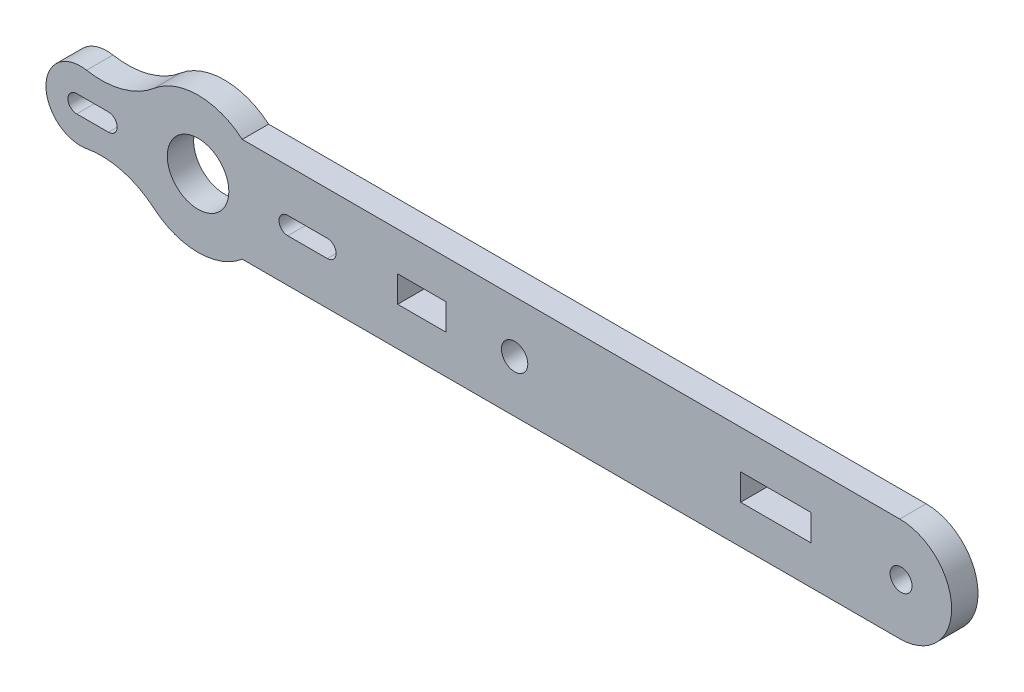
ISO-10303-21;
HEADER;
FILE_DESCRIPTION(('STEP AP214'),'2;1');
FILE_NAME('part.step','',(''),(''),'','','');
FILE_SCHEMA(('AUTOMOTIVE_DESIGN { 1 0 10303 214 1 1 1 1 }'));
ENDSEC;
DATA;
#1=APPLICATION_CONTEXT('core data for automotive mechanical design processes');
#2=APPLICATION_PROTOCOL_DEFINITION('international standard','automotive_design',2000,#1);
#3=PRODUCT_CONTEXT('',#1,'mechanical');
#4=PRODUCT('Part','Part','',(#3));
#5=PRODUCT_RELATED_PRODUCT_CATEGORY('part','',(#4));
#6=PRODUCT_DEFINITION_FORMATION('','',#4);
#7=PRODUCT_DEFINITION_CONTEXT('part definition',#1,'design');
#8=PRODUCT_DEFINITION('design','',#6,#7);
#9=PRODUCT_DEFINITION_SHAPE('','',#8);
#10=(LENGTH_UNIT() NAMED_UNIT(*) SI_UNIT(.MILLI.,.METRE.));
#11=(NAMED_UNIT(*) PLANE_ANGLE_UNIT() SI_UNIT($,.RADIAN.));
#12=(NAMED_UNIT(*) SI_UNIT($,.STERADIAN.) SOLID_ANGLE_UNIT());
#13=UNCERTAINTY_MEASURE_WITH_UNIT(LENGTH_MEASURE(1.E-05),#10,'distance_accuracy_value','');
#14=(GEOMETRIC_REPRESENTATION_CONTEXT(3) GLOBAL_UNCERTAINTY_ASSIGNED_CONTEXT((#13)) GLOBAL_UNIT_ASSIGNED_CONTEXT((#10,
#11,#12)) REPRESENTATION_CONTEXT('',''));
#15=CARTESIAN_POINT('',(0.,0.,0.));
#16=DIRECTION('',(0.,0.,1.));
#17=DIRECTION('',(1.,0.,0.));
#18=AXIS2_PLACEMENT_3D('',#15,#16,#17);
#19=CARTESIAN_POINT('',(-85.7,7.75,-3.));
#20=DIRECTION('',(0.,0.,1.));
#21=DIRECTION('',(1.,0.,0.));
#22=AXIS2_PLACEMENT_3D('',#19,#20,#21);
#23=CYLINDRICAL_SURFACE('',#22,7.75000000000002);
#24=CARTESIAN_POINT('',(-85.7,7.75,0.));
#25=DIRECTION('',(0.,0.,1.));
#26=DIRECTION('',(1.,0.,0.));
#27=AXIS2_PLACEMENT_3D('',#24,#25,#26);
#28=CIRCLE('',#27,7.75000000000002);
#29=CARTESIAN_POINT('',(-80.6748134362991,13.65,0.));
#30=VERTEX_POINT('',#29);
#31=CARTESIAN_POINT('',(-90.708236779375,13.6643946741586,0.));
#32=VERTEX_POINT('',#31);
#33=EDGE_CURVE('E349',#30,#32,#28,.T.);
#34=ORIENTED_EDGE('',*,*,#33,.F.);
#35=DIRECTION('',(0.,0.,1.));
#36=VECTOR('',#35,1.);
#37=CARTESIAN_POINT('',(-80.6748134362991,13.65,-3.));
#38=LINE('',#37,#36);
#39=CARTESIAN_POINT('',(-80.6748134362991,13.65,-3.));
#40=VERTEX_POINT('',#39);
#41=EDGE_CURVE('E11',#40,#30,#38,.T.);
#42=ORIENTED_EDGE('',*,*,#41,.F.);
#43=CARTESIAN_POINT('',(-85.7,7.75,-3.));
#44=DIRECTION('',(0.,0.,1.));
#45=DIRECTION('',(1.,0.,0.));
#46=AXIS2_PLACEMENT_3D('',#43,#44,#45);
#47=CIRCLE('',#46,7.75000000000002);
#48=CARTESIAN_POINT('',(-90.708236779375,13.6643946741586,-3.));
#49=VERTEX_POINT('',#48);
#50=EDGE_CURVE('E352',#40,#49,#47,.T.);
#51=ORIENTED_EDGE('',*,*,#50,.T.);
#52=DIRECTION('',(0.,0.,1.));
#53=VECTOR('',#52,1.);
#54=CARTESIAN_POINT('',(-90.708236779375,13.6643946741586,-3.));
#55=LINE('',#54,#53);
#56=EDGE_CURVE('E43',#49,#32,#55,.T.);
#57=ORIENTED_EDGE('',*,*,#56,.T.);
#58=EDGE_LOOP('',(#34,#42,#51,#57));
#59=FACE_BOUND('',#58,.T.);
#60=ADVANCED_FACE('F40',(#59),#23,.T.);
#61=CARTESIAN_POINT('',(-80.6748134362991,13.65,-3.));
#62=DIRECTION('',(0.,1.,0.));
#63=DIRECTION('',(-1.,0.,0.));
#64=AXIS2_PLACEMENT_3D('',#61,#62,#63);
#65=PLANE('',#64);
#66=DIRECTION('',(-1.,0.,0.));
#67=VECTOR('',#66,1.);
#68=CARTESIAN_POINT('',(-80.6748134362991,13.65,0.));
#69=LINE('',#68,#67);
#70=CARTESIAN_POINT('',(-5.9,13.65,0.));
#71=VERTEX_POINT('',#70);
#72=EDGE_CURVE('E356',#71,#30,#69,.T.);
#73=ORIENTED_EDGE('',*,*,#72,.F.);
#74=DIRECTION('',(0.,0.,1.));
#75=VECTOR('',#74,1.);
#76=CARTESIAN_POINT('',(-5.9,13.65,-3.));
#77=LINE('',#76,#75);
#78=CARTESIAN_POINT('',(-5.9,13.65,-3.));
#79=VERTEX_POINT('',#78);
#80=EDGE_CURVE('E48',#79,#71,#77,.T.);
#81=ORIENTED_EDGE('',*,*,#80,.F.);
#82=DIRECTION('',(-1.,0.,0.));
#83=VECTOR('',#82,1.);
#84=CARTESIAN_POINT('',(-80.6748134362991,13.65,-3.));
#85=LINE('',#84,#83);
#86=EDGE_CURVE('E374',#79,#40,#85,.T.);
#87=ORIENTED_EDGE('',*,*,#86,.T.);
#88=ORIENTED_EDGE('',*,*,#41,.T.);
#89=EDGE_LOOP('',(#73,#81,#87,#88));
#90=FACE_BOUND('',#89,.T.);
#91=ADVANCED_FACE('F421',(#90),#65,.T.);
#92=CARTESIAN_POINT('',(-5.9,7.75,-3.));
#93=DIRECTION('',(0.,0.,1.));
#94=DIRECTION('',(1.,0.,0.));
#95=AXIS2_PLACEMENT_3D('',#92,#93,#94);
#96=CYLINDRICAL_SURFACE('',#95,5.9);
#97=CARTESIAN_POINT('',(-5.9,7.75,0.));
#98=DIRECTION('',(0.,0.,1.));
#99=DIRECTION('',(1.,0.,0.));
#100=AXIS2_PLACEMENT_3D('',#97,#98,#99);
#101=CIRCLE('',#100,5.9);
#102=CARTESIAN_POINT('',(-5.9,1.85,0.));
#103=VERTEX_POINT('',#102);
#104=EDGE_CURVE('E394',#103,#71,#101,.T.);
#105=ORIENTED_EDGE('',*,*,#104,.F.);
#106=DIRECTION('',(0.,0.,1.));
#107=VECTOR('',#106,1.);
#108=CARTESIAN_POINT('',(-5.9,1.85,-3.));
#109=LINE('',#108,#107);
#110=CARTESIAN_POINT('',(-5.9,1.85,-3.));
#111=VERTEX_POINT('',#110);
#112=EDGE_CURVE('E400',#111,#103,#109,.T.);
#113=ORIENTED_EDGE('',*,*,#112,.F.);
#114=CARTESIAN_POINT('',(-5.9,7.75,-3.));
#115=DIRECTION('',(0.,0.,1.));
#116=DIRECTION('',(1.,0.,0.));
#117=AXIS2_PLACEMENT_3D('',#114,#115,#116);
#118=CIRCLE('',#117,5.9);
#119=EDGE_CURVE('E371',#111,#79,#118,.T.);
#120=ORIENTED_EDGE('',*,*,#119,.T.);
#121=ORIENTED_EDGE('',*,*,#80,.T.);
#122=EDGE_LOOP('',(#105,#113,#120,#121));
#123=FACE_BOUND('',#122,.T.);
#124=ADVANCED_FACE('F441',(#123),#96,.T.);
#125=CARTESIAN_POINT('',(-80.6748134362991,1.85,-3.));
#126=DIRECTION('',(0.,-1.,0.));
#127=DIRECTION('',(0.,0.,-1.));
#128=AXIS2_PLACEMENT_3D('',#125,#126,#127);
#129=PLANE('',#128);
#130=DIRECTION('',(1.,0.,0.));
#131=VECTOR('',#130,1.);
#132=CARTESIAN_POINT('',(-80.6748134362991,1.85,0.));
#133=LINE('',#132,#131);
#134=CARTESIAN_POINT('',(-80.6748134362991,1.85,0.));
#135=VERTEX_POINT('',#134);
#136=EDGE_CURVE('E391',#135,#103,#133,.T.);
#137=ORIENTED_EDGE('',*,*,#136,.F.);
#138=DIRECTION('',(0.,0.,1.));
#139=VECTOR('',#138,1.);
#140=CARTESIAN_POINT('',(-80.6748134362991,1.85,-3.));
#141=LINE('',#140,#139);
#142=CARTESIAN_POINT('',(-80.6748134362991,1.85,-3.));
#143=VERTEX_POINT('',#142);
#144=EDGE_CURVE('E402',#143,#135,#141,.T.);
#145=ORIENTED_EDGE('',*,*,#144,.F.);
#146=DIRECTION('',(1.,0.,0.));
#147=VECTOR('',#146,1.);
#148=CARTESIAN_POINT('',(-80.6748134362991,1.85,-3.));
#149=LINE('',#148,#147);
#150=EDGE_CURVE('E368',#143,#111,#149,.T.);
#151=ORIENTED_EDGE('',*,*,#150,.T.);
#152=ORIENTED_EDGE('',*,*,#112,.T.);
#153=EDGE_LOOP('',(#137,#145,#151,#152));
#154=FACE_BOUND('',#153,.T.);
#155=ADVANCED_FACE('F439',(#154),#129,.T.);
#156=CARTESIAN_POINT('',(-85.7,7.75,-3.));
#157=DIRECTION('',(0.,0.,1.));
#158=DIRECTION('',(1.,0.,0.));
#159=AXIS2_PLACEMENT_3D('',#156,#157,#158);
#160=CYLINDRICAL_SURFACE('',#159,7.75000000000001);
#161=CARTESIAN_POINT('',(-85.7,7.75,0.));
#162=DIRECTION('',(0.,0.,1.));
#163=DIRECTION('',(1.,0.,0.));
#164=AXIS2_PLACEMENT_3D('',#161,#162,#163);
#165=CIRCLE('',#164,7.75000000000001);
#166=CARTESIAN_POINT('',(-90.7075191163976,1.83499769240007,0.));
#167=VERTEX_POINT('',#166);
#168=EDGE_CURVE('E388',#167,#135,#165,.T.);
#169=ORIENTED_EDGE('',*,*,#168,.F.);
#170=DIRECTION('',(0.,0.,1.));
#171=VECTOR('',#170,1.);
#172=CARTESIAN_POINT('',(-90.7075191163976,1.83499769240007,-3.));
#173=LINE('',#172,#171);
#174=CARTESIAN_POINT('',(-90.7075191163976,1.83499769240007,-3.));
#175=VERTEX_POINT('',#174);
#176=EDGE_CURVE('E404',#175,#167,#173,.T.);
#177=ORIENTED_EDGE('',*,*,#176,.F.);
#178=CARTESIAN_POINT('',(-85.7,7.75,-3.));
#179=DIRECTION('',(0.,0.,1.));
#180=DIRECTION('',(1.,0.,0.));
#181=AXIS2_PLACEMENT_3D('',#178,#179,#180);
#182=CIRCLE('',#181,7.75000000000001);
#183=EDGE_CURVE('E365',#175,#143,#182,.T.);
#184=ORIENTED_EDGE('',*,*,#183,.T.);
#185=ORIENTED_EDGE('',*,*,#144,.T.);
#186=EDGE_LOOP('',(#169,#177,#184,#185));
#187=FACE_BOUND('',#186,.T.);
#188=ADVANCED_FACE('F435',(#187),#160,.T.);
#189=CARTESIAN_POINT('',(-96.7165420560748,-5.26300507671983,-3.));
#190=DIRECTION('',(0.,0.,1.));
#191=DIRECTION('',(1.,0.,0.));
#192=AXIS2_PLACEMENT_3D('',#189,#190,#191);
#193=CYLINDRICAL_SURFACE('',#192,9.3);
#194=CARTESIAN_POINT('',(-96.7165420560748,-5.26300507671983,0.));
#195=DIRECTION('',(0.,0.,-1.));
#196=DIRECTION('',(1.,0.,0.));
#197=AXIS2_PLACEMENT_3D('',#194,#195,#196);
#198=CIRCLE('',#197,9.3);
#199=CARTESIAN_POINT('',(-98.3750417822377,3.88791720785442,0.));
#200=VERTEX_POINT('',#199);
#201=EDGE_CURVE('E385',#200,#167,#198,.T.);
#202=ORIENTED_EDGE('',*,*,#201,.F.);
#203=DIRECTION('',(0.,0.,1.));
#204=VECTOR('',#203,1.);
#205=CARTESIAN_POINT('',(-98.3750417822377,3.88791720785442,-3.));
#206=LINE('',#205,#204);
#207=CARTESIAN_POINT('',(-98.3750417822377,3.88791720785442,-3.));
#208=VERTEX_POINT('',#207);
#209=EDGE_CURVE('E406',#208,#200,#206,.T.);
#210=ORIENTED_EDGE('',*,*,#209,.F.);
#211=CARTESIAN_POINT('',(-96.7165420560748,-5.26300507671983,-3.));
#212=DIRECTION('',(0.,0.,-1.));
#213=DIRECTION('',(1.,0.,0.));
#214=AXIS2_PLACEMENT_3D('',#211,#212,#213);
#215=CIRCLE('',#214,9.3);
#216=EDGE_CURVE('E362',#208,#175,#215,.T.);
#217=ORIENTED_EDGE('',*,*,#216,.T.);
#218=ORIENTED_EDGE('',*,*,#176,.T.);
#219=EDGE_LOOP('',(#202,#210,#217,#218));
#220=FACE_BOUND('',#219,.T.);
#221=ADVANCED_FACE('F433',(#220),#193,.F.);
#222=CARTESIAN_POINT('',(-99.075,7.75,-3.));
#223=DIRECTION('',(0.,0.,1.));
#224=DIRECTION('',(1.,0.,0.));
#225=AXIS2_PLACEMENT_3D('',#222,#223,#224);
#226=CYLINDRICAL_SURFACE('',#225,3.925);
#227=CARTESIAN_POINT('',(-99.075,7.75,0.));
#228=DIRECTION('',(0.,0.,1.));
#229=DIRECTION('',(1.,0.,0.));
#230=AXIS2_PLACEMENT_3D('',#227,#228,#229);
#231=CIRCLE('',#230,3.925);
#232=CARTESIAN_POINT('',(-98.3744376274743,11.6119732472146,0.));
#233=VERTEX_POINT('',#232);
#234=EDGE_CURVE('E382',#233,#200,#231,.T.);
#235=ORIENTED_EDGE('',*,*,#234,.F.);
#236=DIRECTION('',(0.,0.,1.));
#237=VECTOR('',#236,1.);
#238=CARTESIAN_POINT('',(-98.3744376274743,11.6119732472146,-3.));
#239=LINE('',#238,#237);
#240=CARTESIAN_POINT('',(-98.3744376274743,11.6119732472146,-3.));
#241=VERTEX_POINT('',#240);
#242=EDGE_CURVE('E407',#241,#233,#239,.T.);
#243=ORIENTED_EDGE('',*,*,#242,.F.);
#244=CARTESIAN_POINT('',(-99.075,7.75,-3.));
#245=DIRECTION('',(0.,0.,1.));
#246=DIRECTION('',(1.,0.,0.));
#247=AXIS2_PLACEMENT_3D('',#244,#245,#246);
#248=CIRCLE('',#247,3.925);
#249=EDGE_CURVE('E359',#241,#208,#248,.T.);
#250=ORIENTED_EDGE('',*,*,#249,.T.);
#251=ORIENTED_EDGE('',*,*,#209,.T.);
#252=EDGE_LOOP('',(#235,#243,#250,#251));
#253=FACE_BOUND('',#252,.T.);
#254=ADVANCED_FACE('F429',(#253),#226,.T.);
#255=CARTESIAN_POINT('',(-96.7152886679605,20.7583235881343,-3.));
#256=DIRECTION('',(0.,0.,1.));
#257=DIRECTION('',(1.,0.,0.));
#258=AXIS2_PLACEMENT_3D('',#255,#256,#257);
#259=CYLINDRICAL_SURFACE('',#258,9.2956172376394);
#260=CARTESIAN_POINT('',(-96.7152886679605,20.7583235881343,0.));
#261=DIRECTION('',(0.,0.,-1.));
#262=DIRECTION('',(-1.,0.,0.));
#263=AXIS2_PLACEMENT_3D('',#260,#261,#262);
#264=CIRCLE('',#263,9.2956172376394);
#265=EDGE_CURVE('E379',#32,#233,#264,.T.);
#266=ORIENTED_EDGE('',*,*,#265,.F.);
#267=ORIENTED_EDGE('',*,*,#56,.F.);
#268=CARTESIAN_POINT('',(-96.7152886679605,20.7583235881343,-3.));
#269=DIRECTION('',(0.,0.,-1.));
#270=DIRECTION('',(-1.,0.,0.));
#271=AXIS2_PLACEMENT_3D('',#268,#269,#270);
#272=CIRCLE('',#271,9.2956172376394);
#273=EDGE_CURVE('E355',#49,#241,#272,.T.);
#274=ORIENTED_EDGE('',*,*,#273,.T.);
#275=ORIENTED_EDGE('',*,*,#242,.T.);
#276=EDGE_LOOP('',(#266,#267,#274,#275));
#277=FACE_BOUND('',#276,.T.);
#278=ADVANCED_FACE('F415',(#277),#259,.F.);
#279=CARTESIAN_POINT('',(-85.7,7.75,-3.));
#280=DIRECTION('',(0.,0.,1.));
#281=DIRECTION('',(1.,0.,0.));
#282=AXIS2_PLACEMENT_3D('',#279,#280,#281);
#283=PLANE('',#282);
#284=DIRECTION('',(-1.,0.,0.));
#285=VECTOR('',#284,1.);
#286=CARTESIAN_POINT('',(-99.5,8.75,-3.));
#287=LINE('',#286,#285);
#288=CARTESIAN_POINT('',(-95.9,8.75,-3.));
#289=VERTEX_POINT('',#288);
#290=CARTESIAN_POINT('',(-99.5,8.75,-3.));
#291=VERTEX_POINT('',#290);
#292=EDGE_CURVE('E209',#289,#291,#287,.T.);
#293=ORIENTED_EDGE('',*,*,#292,.T.);
#294=CARTESIAN_POINT('',(-99.5,7.75,-3.));
#295=DIRECTION('',(0.,0.,1.));
#296=DIRECTION('',(1.,0.,0.));
#297=AXIS2_PLACEMENT_3D('',#294,#295,#296);
#298=CIRCLE('',#297,0.999999999999999);
#299=CARTESIAN_POINT('',(-99.5,6.75,-3.));
#300=VERTEX_POINT('',#299);
#301=EDGE_CURVE('E203',#291,#300,#298,.T.);
#302=ORIENTED_EDGE('',*,*,#301,.T.);
#303=DIRECTION('',(1.,0.,0.));
#304=VECTOR('',#303,1.);
#305=CARTESIAN_POINT('',(-99.5,6.75,-3.));
#306=LINE('',#305,#304);
#307=CARTESIAN_POINT('',(-95.9,6.75,-3.));
#308=VERTEX_POINT('',#307);
#309=EDGE_CURVE('E212',#300,#308,#306,.T.);
#310=ORIENTED_EDGE('',*,*,#309,.T.);
#311=CARTESIAN_POINT('',(-95.9,7.75,-3.));
#312=DIRECTION('',(0.,0.,1.));
#313=DIRECTION('',(1.,0.,0.));
#314=AXIS2_PLACEMENT_3D('',#311,#312,#313);
#315=CIRCLE('',#314,0.999999999999999);
#316=EDGE_CURVE('E56',#308,#289,#315,.T.);
#317=ORIENTED_EDGE('',*,*,#316,.T.);
#318=EDGE_LOOP('',(#293,#302,#310,#317));
#319=FACE_BOUND('',#318,.T.);
#320=DIRECTION('',(-1.,0.,0.));
#321=VECTOR('',#320,1.);
#322=CARTESIAN_POINT('',(-75.5,8.75,-3.));
#323=LINE('',#322,#321);
#324=CARTESIAN_POINT('',(-71.,8.75,-3.));
#325=VERTEX_POINT('',#324);
#326=CARTESIAN_POINT('',(-75.5,8.75,-3.));
#327=VERTEX_POINT('',#326);
#328=EDGE_CURVE('E248',#325,#327,#323,.T.);
#329=ORIENTED_EDGE('',*,*,#328,.T.);
#330=CARTESIAN_POINT('',(-75.5,7.75,-3.));
#331=DIRECTION('',(0.,0.,1.));
#332=DIRECTION('',(1.,0.,0.));
#333=AXIS2_PLACEMENT_3D('',#330,#331,#332);
#334=CIRCLE('',#333,1.);
#335=CARTESIAN_POINT('',(-75.5,6.75,-3.));
#336=VERTEX_POINT('',#335);
#337=EDGE_CURVE('E238',#327,#336,#334,.T.);
#338=ORIENTED_EDGE('',*,*,#337,.T.);
#339=DIRECTION('',(1.,0.,0.));
#340=VECTOR('',#339,1.);
#341=CARTESIAN_POINT('',(-75.5,6.75,-3.));
#342=LINE('',#341,#340);
#343=CARTESIAN_POINT('',(-71.,6.75,-3.));
#344=VERTEX_POINT('',#343);
#345=EDGE_CURVE('E241',#336,#344,#342,.T.);
#346=ORIENTED_EDGE('',*,*,#345,.T.);
#347=CARTESIAN_POINT('',(-71.,7.75,-3.));
#348=DIRECTION('',(0.,0.,1.));
#349=DIRECTION('',(1.,0.,0.));
#350=AXIS2_PLACEMENT_3D('',#347,#348,#349);
#351=CIRCLE('',#350,1.);
#352=EDGE_CURVE('E245',#344,#325,#351,.T.);
#353=ORIENTED_EDGE('',*,*,#352,.T.);
#354=EDGE_LOOP('',(#329,#338,#346,#353));
#355=FACE_BOUND('',#354,.T.);
#356=DIRECTION('',(-1.,0.,0.));
#357=VECTOR('',#356,1.);
#358=CARTESIAN_POINT('',(-63.,9.25,-3.));
#359=LINE('',#358,#357);
#360=CARTESIAN_POINT('',(-57.5,9.25,-3.));
#361=VERTEX_POINT('',#360);
#362=CARTESIAN_POINT('',(-63.,9.25,-3.));
#363=VERTEX_POINT('',#362);
#364=EDGE_CURVE('E280',#361,#363,#359,.T.);
#365=ORIENTED_EDGE('',*,*,#364,.T.);
#366=DIRECTION('',(0.,-1.,0.));
#367=VECTOR('',#366,1.);
#368=CARTESIAN_POINT('',(-63.,9.25,-3.));
#369=LINE('',#368,#367);
#370=CARTESIAN_POINT('',(-63.,6.25,-3.));
#371=VERTEX_POINT('',#370);
#372=EDGE_CURVE('E270',#363,#371,#369,.T.);
#373=ORIENTED_EDGE('',*,*,#372,.T.);
#374=DIRECTION('',(1.,0.,0.));
#375=VECTOR('',#374,1.);
#376=CARTESIAN_POINT('',(-63.,6.25,-3.));
#377=LINE('',#376,#375);
#378=CARTESIAN_POINT('',(-57.5,6.25,-3.));
#379=VERTEX_POINT('',#378);
#380=EDGE_CURVE('E273',#371,#379,#377,.T.);
#381=ORIENTED_EDGE('',*,*,#380,.T.);
#382=DIRECTION('',(0.,1.,0.));
#383=VECTOR('',#382,1.);
#384=CARTESIAN_POINT('',(-57.5,9.25,-3.));
#385=LINE('',#384,#383);
#386=EDGE_CURVE('E277',#379,#361,#385,.T.);
#387=ORIENTED_EDGE('',*,*,#386,.T.);
#388=EDGE_LOOP('',(#365,#373,#381,#387));
#389=FACE_BOUND('',#388,.T.);
#390=CARTESIAN_POINT('',(-49.7,7.75,-3.));
#391=DIRECTION('',(0.,0.,1.));
#392=DIRECTION('',(1.,0.,0.));
#393=AXIS2_PLACEMENT_3D('',#390,#391,#392);
#394=CIRCLE('',#393,1.5);
#395=CARTESIAN_POINT('',(-48.2,7.75,-3.));
#396=VERTEX_POINT('',#395);
#397=EDGE_CURVE('E302',#396,#396,#394,.T.);
#398=ORIENTED_EDGE('',*,*,#397,.T.);
#399=EDGE_LOOP('',(#398));
#400=FACE_BOUND('',#399,.T.);
#401=CARTESIAN_POINT('',(-5.75,7.75,-3.));
#402=DIRECTION('',(0.,0.,1.));
#403=DIRECTION('',(1.,0.,0.));
#404=AXIS2_PLACEMENT_3D('',#401,#402,#403);
#405=CIRCLE('',#404,1.25);
#406=CARTESIAN_POINT('',(-4.5,7.75,-3.));
#407=VERTEX_POINT('',#406);
#408=EDGE_CURVE('E308',#407,#407,#405,.T.);
#409=ORIENTED_EDGE('',*,*,#408,.T.);
#410=EDGE_LOOP('',(#409));
#411=FACE_BOUND('',#410,.T.);
#412=DIRECTION('',(-1.,0.,0.));
#413=VECTOR('',#412,1.);
#414=CARTESIAN_POINT('',(-24.,9.25,-3.));
#415=LINE('',#414,#413);
#416=CARTESIAN_POINT('',(-16.,9.25,-3.));
#417=VERTEX_POINT('',#416);
#418=CARTESIAN_POINT('',(-24.,9.25,-3.));
#419=VERTEX_POINT('',#418);
#420=EDGE_CURVE('E324',#417,#419,#415,.T.);
#421=ORIENTED_EDGE('',*,*,#420,.T.);
#422=DIRECTION('',(0.,-1.,0.));
#423=VECTOR('',#422,1.);
#424=CARTESIAN_POINT('',(-24.,9.25,-3.));
#425=LINE('',#424,#423);
#426=CARTESIAN_POINT('',(-24.,6.25,-3.));
#427=VERTEX_POINT('',#426);
#428=EDGE_CURVE('E314',#419,#427,#425,.T.);
#429=ORIENTED_EDGE('',*,*,#428,.T.);
#430=DIRECTION('',(1.,0.,0.));
#431=VECTOR('',#430,1.);
#432=CARTESIAN_POINT('',(-24.,6.25,-3.));
#433=LINE('',#432,#431);
#434=CARTESIAN_POINT('',(-16.,6.25,-3.));
#435=VERTEX_POINT('',#434);
#436=EDGE_CURVE('E317',#427,#435,#433,.T.);
#437=ORIENTED_EDGE('',*,*,#436,.T.);
#438=DIRECTION('',(0.,1.,0.));
#439=VECTOR('',#438,1.);
#440=CARTESIAN_POINT('',(-16.,9.25,-3.));
#441=LINE('',#440,#439);
#442=EDGE_CURVE('E321',#435,#417,#441,.T.);
#443=ORIENTED_EDGE('',*,*,#442,.T.);
#444=EDGE_LOOP('',(#421,#429,#437,#443));
#445=FACE_BOUND('',#444,.T.);
#446=CARTESIAN_POINT('',(-85.7,7.75,-3.));
#447=DIRECTION('',(0.,0.,1.));
#448=DIRECTION('',(1.,0.,0.));
#449=AXIS2_PLACEMENT_3D('',#446,#447,#448);
#450=CIRCLE('',#449,3.50000000000001);
#451=CARTESIAN_POINT('',(-82.2,7.75,-3.));
#452=VERTEX_POINT('',#451);
#453=EDGE_CURVE('E346',#452,#452,#450,.T.);
#454=ORIENTED_EDGE('',*,*,#453,.T.);
#455=EDGE_LOOP('',(#454));
#456=FACE_BOUND('',#455,.T.);
#457=ORIENTED_EDGE('',*,*,#50,.F.);
#458=ORIENTED_EDGE('',*,*,#86,.F.);
#459=ORIENTED_EDGE('',*,*,#119,.F.);
#460=ORIENTED_EDGE('',*,*,#150,.F.);
#461=ORIENTED_EDGE('',*,*,#183,.F.);
#462=ORIENTED_EDGE('',*,*,#216,.F.);
#463=ORIENTED_EDGE('',*,*,#249,.F.);
#464=ORIENTED_EDGE('',*,*,#273,.F.);
#465=EDGE_LOOP('',(#457,#458,#459,#460,#461,#462,#463,#464));
#466=FACE_BOUND('',#465,.T.);
#467=ADVANCED_FACE('F216',(#319,#355,#389,#400,#411,#445,#456,#466),#283,.F.);
#468=CARTESIAN_POINT('',(-85.7,7.75,0.));
#469=DIRECTION('',(0.,0.,1.));
#470=DIRECTION('',(1.,0.,0.));
#471=AXIS2_PLACEMENT_3D('',#468,#469,#470);
#472=PLANE('',#471);
#473=CARTESIAN_POINT('',(-99.5,7.75,0.));
#474=DIRECTION('',(0.,0.,1.));
#475=DIRECTION('',(1.,0.,0.));
#476=AXIS2_PLACEMENT_3D('',#473,#474,#475);
#477=CIRCLE('',#476,0.999999999999999);
#478=CARTESIAN_POINT('',(-99.5,8.75,0.));
#479=VERTEX_POINT('',#478);
#480=CARTESIAN_POINT('',(-99.5,6.75,0.));
#481=VERTEX_POINT('',#480);
#482=EDGE_CURVE('E64',#479,#481,#477,.T.);
#483=ORIENTED_EDGE('',*,*,#482,.F.);
#484=DIRECTION('',(-1.,0.,0.));
#485=VECTOR('',#484,1.);
#486=CARTESIAN_POINT('',(-99.5,8.75,0.));
#487=LINE('',#486,#485);
#488=CARTESIAN_POINT('',(-95.9,8.75,0.));
#489=VERTEX_POINT('',#488);
#490=EDGE_CURVE('E219',#489,#479,#487,.T.);
#491=ORIENTED_EDGE('',*,*,#490,.F.);
#492=CARTESIAN_POINT('',(-95.9,7.75,0.));
#493=DIRECTION('',(0.,0.,1.));
#494=DIRECTION('',(1.,0.,0.));
#495=AXIS2_PLACEMENT_3D('',#492,#493,#494);
#496=CIRCLE('',#495,0.999999999999999);
#497=CARTESIAN_POINT('',(-95.9,6.75,0.));
#498=VERTEX_POINT('',#497);
#499=EDGE_CURVE('E222',#498,#489,#496,.T.);
#500=ORIENTED_EDGE('',*,*,#499,.F.);
#501=DIRECTION('',(1.,0.,0.));
#502=VECTOR('',#501,1.);
#503=CARTESIAN_POINT('',(-99.5,6.75,0.));
#504=LINE('',#503,#502);
#505=EDGE_CURVE('E228',#481,#498,#504,.T.);
#506=ORIENTED_EDGE('',*,*,#505,.F.);
#507=EDGE_LOOP('',(#483,#491,#500,#506));
#508=FACE_BOUND('',#507,.T.);
#509=CARTESIAN_POINT('',(-75.5,7.75,0.));
#510=DIRECTION('',(0.,0.,1.));
#511=DIRECTION('',(1.,0.,0.));
#512=AXIS2_PLACEMENT_3D('',#509,#510,#511);
#513=CIRCLE('',#512,1.);
#514=CARTESIAN_POINT('',(-75.5,8.75,0.));
#515=VERTEX_POINT('',#514);
#516=CARTESIAN_POINT('',(-75.5,6.75,0.));
#517=VERTEX_POINT('',#516);
#518=EDGE_CURVE('E234',#515,#517,#513,.T.);
#519=ORIENTED_EDGE('',*,*,#518,.F.);
#520=DIRECTION('',(-1.,0.,0.));
#521=VECTOR('',#520,1.);
#522=CARTESIAN_POINT('',(-75.5,8.75,0.));
#523=LINE('',#522,#521);
#524=CARTESIAN_POINT('',(-71.,8.75,0.));
#525=VERTEX_POINT('',#524);
#526=EDGE_CURVE('E242',#525,#515,#523,.T.);
#527=ORIENTED_EDGE('',*,*,#526,.F.);
#528=CARTESIAN_POINT('',(-71.,7.75,0.));
#529=DIRECTION('',(0.,0.,1.));
#530=DIRECTION('',(1.,0.,0.));
#531=AXIS2_PLACEMENT_3D('',#528,#529,#530);
#532=CIRCLE('',#531,1.);
#533=CARTESIAN_POINT('',(-71.,6.75,0.));
#534=VERTEX_POINT('',#533);
#535=EDGE_CURVE('E256',#534,#525,#532,.T.);
#536=ORIENTED_EDGE('',*,*,#535,.F.);
#537=DIRECTION('',(1.,0.,0.));
#538=VECTOR('',#537,1.);
#539=CARTESIAN_POINT('',(-75.5,6.75,0.));
#540=LINE('',#539,#538);
#541=EDGE_CURVE('E253',#517,#534,#540,.T.);
#542=ORIENTED_EDGE('',*,*,#541,.F.);
#543=EDGE_LOOP('',(#519,#527,#536,#542));
#544=FACE_BOUND('',#543,.T.);
#545=DIRECTION('',(0.,-1.,0.));
#546=VECTOR('',#545,1.);
#547=CARTESIAN_POINT('',(-63.,9.25,0.));
#548=LINE('',#547,#546);
#549=CARTESIAN_POINT('',(-63.,9.25,0.));
#550=VERTEX_POINT('',#549);
#551=CARTESIAN_POINT('',(-63.,6.25,0.));
#552=VERTEX_POINT('',#551);
#553=EDGE_CURVE('E263',#550,#552,#548,.T.);
#554=ORIENTED_EDGE('',*,*,#553,.F.);
#555=DIRECTION('',(-1.,0.,0.));
#556=VECTOR('',#555,1.);
#557=CARTESIAN_POINT('',(-63.,9.25,0.));
#558=LINE('',#557,#556);
#559=CARTESIAN_POINT('',(-57.5,9.25,0.));
#560=VERTEX_POINT('',#559);
#561=EDGE_CURVE('E274',#560,#550,#558,.T.);
#562=ORIENTED_EDGE('',*,*,#561,.F.);
#563=DIRECTION('',(0.,1.,0.));
#564=VECTOR('',#563,1.);
#565=CARTESIAN_POINT('',(-57.5,9.25,0.));
#566=LINE('',#565,#564);
#567=CARTESIAN_POINT('',(-57.5,6.25,0.));
#568=VERTEX_POINT('',#567);
#569=EDGE_CURVE('E288',#568,#560,#566,.T.);
#570=ORIENTED_EDGE('',*,*,#569,.F.);
#571=DIRECTION('',(1.,0.,0.));
#572=VECTOR('',#571,1.);
#573=CARTESIAN_POINT('',(-63.,6.25,0.));
#574=LINE('',#573,#572);
#575=EDGE_CURVE('E285',#552,#568,#574,.T.);
#576=ORIENTED_EDGE('',*,*,#575,.F.);
#577=EDGE_LOOP('',(#554,#562,#570,#576));
#578=FACE_BOUND('',#577,.T.);
#579=CARTESIAN_POINT('',(-49.7,7.75,0.));
#580=DIRECTION('',(0.,0.,1.));
#581=DIRECTION('',(1.,0.,0.));
#582=AXIS2_PLACEMENT_3D('',#579,#580,#581);
#583=CIRCLE('',#582,1.5);
#584=CARTESIAN_POINT('',(-48.2,7.75,0.));
#585=VERTEX_POINT('',#584);
#586=EDGE_CURVE('E295',#585,#585,#583,.T.);
#587=ORIENTED_EDGE('',*,*,#586,.F.);
#588=EDGE_LOOP('',(#587));
#589=FACE_BOUND('',#588,.T.);
#590=CARTESIAN_POINT('',(-5.75,7.75,0.));
#591=DIRECTION('',(0.,0.,1.));
#592=DIRECTION('',(1.,0.,0.));
#593=AXIS2_PLACEMENT_3D('',#590,#591,#592);
#594=CIRCLE('',#593,1.25);
#595=CARTESIAN_POINT('',(-4.5,7.75,0.));
#596=VERTEX_POINT('',#595);
#597=EDGE_CURVE('E305',#596,#596,#594,.T.);
#598=ORIENTED_EDGE('',*,*,#597,.F.);
#599=EDGE_LOOP('',(#598));
#600=FACE_BOUND('',#599,.T.);
#601=DIRECTION('',(0.,-1.,0.));
#602=VECTOR('',#601,1.);
#603=CARTESIAN_POINT('',(-24.,9.25,0.));
#604=LINE('',#603,#602);
#605=CARTESIAN_POINT('',(-24.,9.25,0.));
#606=VERTEX_POINT('',#605);
#607=CARTESIAN_POINT('',(-24.,6.25,0.));
#608=VERTEX_POINT('',#607);
#609=EDGE_CURVE('E311',#606,#608,#604,.T.);
#610=ORIENTED_EDGE('',*,*,#609,.F.);
#611=DIRECTION('',(-1.,0.,0.));
#612=VECTOR('',#611,1.);
#613=CARTESIAN_POINT('',(-24.,9.25,0.));
#614=LINE('',#613,#612);
#615=CARTESIAN_POINT('',(-16.,9.25,0.));
#616=VERTEX_POINT('',#615);
#617=EDGE_CURVE('E318',#616,#606,#614,.T.);
#618=ORIENTED_EDGE('',*,*,#617,.F.);
#619=DIRECTION('',(0.,1.,0.));
#620=VECTOR('',#619,1.);
#621=CARTESIAN_POINT('',(-16.,9.25,0.));
#622=LINE('',#621,#620);
#623=CARTESIAN_POINT('',(-16.,6.25,0.));
#624=VERTEX_POINT('',#623);
#625=EDGE_CURVE('E332',#624,#616,#622,.T.);
#626=ORIENTED_EDGE('',*,*,#625,.F.);
#627=DIRECTION('',(1.,0.,0.));
#628=VECTOR('',#627,1.);
#629=CARTESIAN_POINT('',(-24.,6.25,0.));
#630=LINE('',#629,#628);
#631=EDGE_CURVE('E329',#608,#624,#630,.T.);
#632=ORIENTED_EDGE('',*,*,#631,.F.);
#633=EDGE_LOOP('',(#610,#618,#626,#632));
#634=FACE_BOUND('',#633,.T.);
#635=CARTESIAN_POINT('',(-85.7,7.75,0.));
#636=DIRECTION('',(0.,0.,1.));
#637=DIRECTION('',(1.,0.,0.));
#638=AXIS2_PLACEMENT_3D('',#635,#636,#637);
#639=CIRCLE('',#638,3.50000000000001);
#640=CARTESIAN_POINT('',(-82.2,7.75,0.));
#641=VERTEX_POINT('',#640);
#642=EDGE_CURVE('E339',#641,#641,#639,.T.);
#643=ORIENTED_EDGE('',*,*,#642,.F.);
#644=EDGE_LOOP('',(#643));
#645=FACE_BOUND('',#644,.T.);
#646=ORIENTED_EDGE('',*,*,#33,.T.);
#647=ORIENTED_EDGE('',*,*,#265,.T.);
#648=ORIENTED_EDGE('',*,*,#234,.T.);
#649=ORIENTED_EDGE('',*,*,#201,.T.);
#650=ORIENTED_EDGE('',*,*,#168,.T.);
#651=ORIENTED_EDGE('',*,*,#136,.T.);
#652=ORIENTED_EDGE('',*,*,#104,.T.);
#653=ORIENTED_EDGE('',*,*,#72,.T.);
#654=EDGE_LOOP('',(#646,#647,#648,#649,#650,#651,#652,#653));
#655=FACE_BOUND('',#654,.T.);
#656=ADVANCED_FACE('F417',(#508,#544,#578,#589,#600,#634,#645,#655),#472,.T.);
#657=CARTESIAN_POINT('',(-85.7,7.75,-3.));
#658=DIRECTION('',(0.,0.,1.));
#659=DIRECTION('',(1.,0.,0.));
#660=AXIS2_PLACEMENT_3D('',#657,#658,#659);
#661=CYLINDRICAL_SURFACE('',#660,3.50000000000001);
#662=ORIENTED_EDGE('',*,*,#453,.F.);
#663=EDGE_LOOP('',(#662));
#664=FACE_BOUND('',#663,.T.);
#665=ORIENTED_EDGE('',*,*,#642,.T.);
#666=EDGE_LOOP('',(#665));
#667=FACE_BOUND('',#666,.T.);
#668=ADVANCED_FACE('F523',(#664,#667),#661,.F.);
#669=CARTESIAN_POINT('',(-24.,9.25,-3.));
#670=DIRECTION('',(-1.,0.,0.));
#671=DIRECTION('',(0.,0.,1.));
#672=AXIS2_PLACEMENT_3D('',#669,#670,#671);
#673=PLANE('',#672);
#674=ORIENTED_EDGE('',*,*,#609,.T.);
#675=DIRECTION('',(0.,0.,1.));
#676=VECTOR('',#675,1.);
#677=CARTESIAN_POINT('',(-24.,6.25,-3.));
#678=LINE('',#677,#676);
#679=EDGE_CURVE('E327',#427,#608,#678,.T.);
#680=ORIENTED_EDGE('',*,*,#679,.F.);
#681=ORIENTED_EDGE('',*,*,#428,.F.);
#682=DIRECTION('',(0.,0.,1.));
#683=VECTOR('',#682,1.);
#684=CARTESIAN_POINT('',(-24.,9.25,-3.));
#685=LINE('',#684,#683);
#686=EDGE_CURVE('E337',#419,#606,#685,.T.);
#687=ORIENTED_EDGE('',*,*,#686,.T.);
#688=EDGE_LOOP('',(#674,#680,#681,#687));
#689=FACE_BOUND('',#688,.T.);
#690=ADVANCED_FACE('F534',(#689),#673,.F.);
#691=CARTESIAN_POINT('',(-24.,9.25,-3.));
#692=DIRECTION('',(0.,1.,0.));
#693=DIRECTION('',(0.,0.,1.));
#694=AXIS2_PLACEMENT_3D('',#691,#692,#693);
#695=PLANE('',#694);
#696=ORIENTED_EDGE('',*,*,#617,.T.);
#697=ORIENTED_EDGE('',*,*,#686,.F.);
#698=ORIENTED_EDGE('',*,*,#420,.F.);
#699=DIRECTION('',(0.,0.,1.));
#700=VECTOR('',#699,1.);
#701=CARTESIAN_POINT('',(-16.,9.25,-3.));
#702=LINE('',#701,#700);
#703=EDGE_CURVE('E340',#417,#616,#702,.T.);
#704=ORIENTED_EDGE('',*,*,#703,.T.);
#705=EDGE_LOOP('',(#696,#697,#698,#704));
#706=FACE_BOUND('',#705,.T.);
#707=ADVANCED_FACE('F545',(#706),#695,.F.);
#708=CARTESIAN_POINT('',(-16.,9.25,-3.));
#709=DIRECTION('',(1.,0.,0.));
#710=DIRECTION('',(0.,0.,-1.));
#711=AXIS2_PLACEMENT_3D('',#708,#709,#710);
#712=PLANE('',#711);
#713=ORIENTED_EDGE('',*,*,#625,.T.);
#714=ORIENTED_EDGE('',*,*,#703,.F.);
#715=ORIENTED_EDGE('',*,*,#442,.F.);
#716=DIRECTION('',(0.,0.,1.));
#717=VECTOR('',#716,1.);
#718=CARTESIAN_POINT('',(-16.,6.25,-3.));
#719=LINE('',#718,#717);
#720=EDGE_CURVE('E342',#435,#624,#719,.T.);
#721=ORIENTED_EDGE('',*,*,#720,.T.);
#722=EDGE_LOOP('',(#713,#714,#715,#721));
#723=FACE_BOUND('',#722,.T.);
#724=ADVANCED_FACE('F556',(#723),#712,.F.);
#725=CARTESIAN_POINT('',(-24.,6.25,-3.));
#726=DIRECTION('',(0.,-1.,0.));
#727=DIRECTION('',(0.,0.,-1.));
#728=AXIS2_PLACEMENT_3D('',#725,#726,#727);
#729=PLANE('',#728);
#730=ORIENTED_EDGE('',*,*,#631,.T.);
#731=ORIENTED_EDGE('',*,*,#720,.F.);
#732=ORIENTED_EDGE('',*,*,#436,.F.);
#733=ORIENTED_EDGE('',*,*,#679,.T.);
#734=EDGE_LOOP('',(#730,#731,#732,#733));
#735=FACE_BOUND('',#734,.T.);
#736=ADVANCED_FACE('F567',(#735),#729,.F.);
#737=CARTESIAN_POINT('',(-5.75,7.75,-3.));
#738=DIRECTION('',(0.,0.,1.));
#739=DIRECTION('',(1.,0.,0.));
#740=AXIS2_PLACEMENT_3D('',#737,#738,#739);
#741=CYLINDRICAL_SURFACE('',#740,1.25);
#742=ORIENTED_EDGE('',*,*,#408,.F.);
#743=EDGE_LOOP('',(#742));
#744=FACE_BOUND('',#743,.T.);
#745=ORIENTED_EDGE('',*,*,#597,.T.);
#746=EDGE_LOOP('',(#745));
#747=FACE_BOUND('',#746,.T.);
#748=ADVANCED_FACE('F578',(#744,#747),#741,.F.);
#749=CARTESIAN_POINT('',(-49.7,7.75,-3.));
#750=DIRECTION('',(0.,0.,1.));
#751=DIRECTION('',(1.,0.,0.));
#752=AXIS2_PLACEMENT_3D('',#749,#750,#751);
#753=CYLINDRICAL_SURFACE('',#752,1.5);
#754=ORIENTED_EDGE('',*,*,#397,.F.);
#755=EDGE_LOOP('',(#754));
#756=FACE_BOUND('',#755,.T.);
#757=ORIENTED_EDGE('',*,*,#586,.T.);
#758=EDGE_LOOP('',(#757));
#759=FACE_BOUND('',#758,.T.);
#760=ADVANCED_FACE('F589',(#756,#759),#753,.F.);
#761=CARTESIAN_POINT('',(-63.,9.25,-3.));
#762=DIRECTION('',(-1.,0.,0.));
#763=DIRECTION('',(0.,0.,1.));
#764=AXIS2_PLACEMENT_3D('',#761,#762,#763);
#765=PLANE('',#764);
#766=ORIENTED_EDGE('',*,*,#553,.T.);
#767=DIRECTION('',(0.,0.,1.));
#768=VECTOR('',#767,1.);
#769=CARTESIAN_POINT('',(-63.,6.25,-3.));
#770=LINE('',#769,#768);
#771=EDGE_CURVE('E283',#371,#552,#770,.T.);
#772=ORIENTED_EDGE('',*,*,#771,.F.);
#773=ORIENTED_EDGE('',*,*,#372,.F.);
#774=DIRECTION('',(0.,0.,1.));
#775=VECTOR('',#774,1.);
#776=CARTESIAN_POINT('',(-63.,9.25,-3.));
#777=LINE('',#776,#775);
#778=EDGE_CURVE('E293',#363,#550,#777,.T.);
#779=ORIENTED_EDGE('',*,*,#778,.T.);
#780=EDGE_LOOP('',(#766,#772,#773,#779));
#781=FACE_BOUND('',#780,.T.);
#782=ADVANCED_FACE('F600',(#781),#765,.F.);
#783=CARTESIAN_POINT('',(-63.,9.25,-3.));
#784=DIRECTION('',(0.,1.,0.));
#785=DIRECTION('',(0.,0.,1.));
#786=AXIS2_PLACEMENT_3D('',#783,#784,#785);
#787=PLANE('',#786);
#788=ORIENTED_EDGE('',*,*,#561,.T.);
#789=ORIENTED_EDGE('',*,*,#778,.F.);
#790=ORIENTED_EDGE('',*,*,#364,.F.);
#791=DIRECTION('',(0.,0.,1.));
#792=VECTOR('',#791,1.);
#793=CARTESIAN_POINT('',(-57.5,9.25,-3.));
#794=LINE('',#793,#792);
#795=EDGE_CURVE('E296',#361,#560,#794,.T.);
#796=ORIENTED_EDGE('',*,*,#795,.T.);
#797=EDGE_LOOP('',(#788,#789,#790,#796));
#798=FACE_BOUND('',#797,.T.);
#799=ADVANCED_FACE('F611',(#798),#787,.F.);
#800=CARTESIAN_POINT('',(-57.5,9.25,-3.));
#801=DIRECTION('',(1.,0.,0.));
#802=DIRECTION('',(0.,0.,-1.));
#803=AXIS2_PLACEMENT_3D('',#800,#801,#802);
#804=PLANE('',#803);
#805=ORIENTED_EDGE('',*,*,#569,.T.);
#806=ORIENTED_EDGE('',*,*,#795,.F.);
#807=ORIENTED_EDGE('',*,*,#386,.F.);
#808=DIRECTION('',(0.,0.,1.));
#809=VECTOR('',#808,1.);
#810=CARTESIAN_POINT('',(-57.5,6.25,-3.));
#811=LINE('',#810,#809);
#812=EDGE_CURVE('E298',#379,#568,#811,.T.);
#813=ORIENTED_EDGE('',*,*,#812,.T.);
#814=EDGE_LOOP('',(#805,#806,#807,#813));
#815=FACE_BOUND('',#814,.T.);
#816=ADVANCED_FACE('F622',(#815),#804,.F.);
#817=CARTESIAN_POINT('',(-63.,6.25,-3.));
#818=DIRECTION('',(0.,-1.,0.));
#819=DIRECTION('',(0.,0.,-1.));
#820=AXIS2_PLACEMENT_3D('',#817,#818,#819);
#821=PLANE('',#820);
#822=ORIENTED_EDGE('',*,*,#575,.T.);
#823=ORIENTED_EDGE('',*,*,#812,.F.);
#824=ORIENTED_EDGE('',*,*,#380,.F.);
#825=ORIENTED_EDGE('',*,*,#771,.T.);
#826=EDGE_LOOP('',(#822,#823,#824,#825));
#827=FACE_BOUND('',#826,.T.);
#828=ADVANCED_FACE('F633',(#827),#821,.F.);
#829=CARTESIAN_POINT('',(-75.5,7.75,-3.));
#830=DIRECTION('',(0.,0.,1.));
#831=DIRECTION('',(1.,0.,0.));
#832=AXIS2_PLACEMENT_3D('',#829,#830,#831);
#833=CYLINDRICAL_SURFACE('',#832,1.);
#834=ORIENTED_EDGE('',*,*,#518,.T.);
#835=DIRECTION('',(0.,0.,1.));
#836=VECTOR('',#835,1.);
#837=CARTESIAN_POINT('',(-75.5,6.75,-3.));
#838=LINE('',#837,#836);
#839=EDGE_CURVE('E251',#336,#517,#838,.T.);
#840=ORIENTED_EDGE('',*,*,#839,.F.);
#841=ORIENTED_EDGE('',*,*,#337,.F.);
#842=DIRECTION('',(0.,0.,1.));
#843=VECTOR('',#842,1.);
#844=CARTESIAN_POINT('',(-75.5,8.75,-3.));
#845=LINE('',#844,#843);
#846=EDGE_CURVE('E261',#327,#515,#845,.T.);
#847=ORIENTED_EDGE('',*,*,#846,.T.);
#848=EDGE_LOOP('',(#834,#840,#841,#847));
#849=FACE_BOUND('',#848,.T.);
#850=ADVANCED_FACE('F644',(#849),#833,.F.);
#851=CARTESIAN_POINT('',(-75.5,8.75,-3.));
#852=DIRECTION('',(0.,1.,0.));
#853=DIRECTION('',(0.,0.,1.));
#854=AXIS2_PLACEMENT_3D('',#851,#852,#853);
#855=PLANE('',#854);
#856=ORIENTED_EDGE('',*,*,#526,.T.);
#857=ORIENTED_EDGE('',*,*,#846,.F.);
#858=ORIENTED_EDGE('',*,*,#328,.F.);
#859=DIRECTION('',(0.,0.,1.));
#860=VECTOR('',#859,1.);
#861=CARTESIAN_POINT('',(-71.,8.75,-3.));
#862=LINE('',#861,#860);
#863=EDGE_CURVE('E264',#325,#525,#862,.T.);
#864=ORIENTED_EDGE('',*,*,#863,.T.);
#865=EDGE_LOOP('',(#856,#857,#858,#864));
#866=FACE_BOUND('',#865,.T.);
#867=ADVANCED_FACE('F655',(#866),#855,.F.);
#868=CARTESIAN_POINT('',(-71.,7.75,-3.));
#869=DIRECTION('',(0.,0.,1.));
#870=DIRECTION('',(1.,0.,0.));
#871=AXIS2_PLACEMENT_3D('',#868,#869,#870);
#872=CYLINDRICAL_SURFACE('',#871,1.);
#873=ORIENTED_EDGE('',*,*,#535,.T.);
#874=ORIENTED_EDGE('',*,*,#863,.F.);
#875=ORIENTED_EDGE('',*,*,#352,.F.);
#876=DIRECTION('',(0.,0.,1.));
#877=VECTOR('',#876,1.);
#878=CARTESIAN_POINT('',(-71.,6.75,-3.));
#879=LINE('',#878,#877);
#880=EDGE_CURVE('E266',#344,#534,#879,.T.);
#881=ORIENTED_EDGE('',*,*,#880,.T.);
#882=EDGE_LOOP('',(#873,#874,#875,#881));
#883=FACE_BOUND('',#882,.T.);
#884=ADVANCED_FACE('F666',(#883),#872,.F.);
#885=CARTESIAN_POINT('',(-75.5,6.75,-3.));
#886=DIRECTION('',(0.,-1.,0.));
#887=DIRECTION('',(0.,0.,-1.));
#888=AXIS2_PLACEMENT_3D('',#885,#886,#887);
#889=PLANE('',#888);
#890=ORIENTED_EDGE('',*,*,#541,.T.);
#891=ORIENTED_EDGE('',*,*,#880,.F.);
#892=ORIENTED_EDGE('',*,*,#345,.F.);
#893=ORIENTED_EDGE('',*,*,#839,.T.);
#894=EDGE_LOOP('',(#890,#891,#892,#893));
#895=FACE_BOUND('',#894,.T.);
#896=ADVANCED_FACE('F677',(#895),#889,.F.);
#897=CARTESIAN_POINT('',(-99.5,7.75,-3.));
#898=DIRECTION('',(0.,0.,1.));
#899=DIRECTION('',(1.,0.,0.));
#900=AXIS2_PLACEMENT_3D('',#897,#898,#899);
#901=CYLINDRICAL_SURFACE('',#900,0.999999999999999);
#902=ORIENTED_EDGE('',*,*,#482,.T.);
#903=DIRECTION('',(0.,0.,1.));
#904=VECTOR('',#903,1.);
#905=CARTESIAN_POINT('',(-99.5,6.75,-3.));
#906=LINE('',#905,#904);
#907=EDGE_CURVE('E199',#300,#481,#906,.T.);
#908=ORIENTED_EDGE('',*,*,#907,.F.);
#909=ORIENTED_EDGE('',*,*,#301,.F.);
#910=DIRECTION('',(0.,0.,1.));
#911=VECTOR('',#910,1.);
#912=CARTESIAN_POINT('',(-99.5,8.75,-3.));
#913=LINE('',#912,#911);
#914=EDGE_CURVE('E232',#291,#479,#913,.T.);
#915=ORIENTED_EDGE('',*,*,#914,.T.);
#916=EDGE_LOOP('',(#902,#908,#909,#915));
#917=FACE_BOUND('',#916,.T.);
#918=ADVANCED_FACE('F201',(#917),#901,.F.);
#919=CARTESIAN_POINT('',(-99.5,8.75,-3.));
#920=DIRECTION('',(0.,1.,0.));
#921=DIRECTION('',(0.,0.,1.));
#922=AXIS2_PLACEMENT_3D('',#919,#920,#921);
#923=PLANE('',#922);
#924=ORIENTED_EDGE('',*,*,#490,.T.);
#925=ORIENTED_EDGE('',*,*,#914,.F.);
#926=ORIENTED_EDGE('',*,*,#292,.F.);
#927=DIRECTION('',(0.,0.,1.));
#928=VECTOR('',#927,1.);
#929=CARTESIAN_POINT('',(-95.9,8.75,-3.));
#930=LINE('',#929,#928);
#931=EDGE_CURVE('E235',#289,#489,#930,.T.);
#932=ORIENTED_EDGE('',*,*,#931,.T.);
#933=EDGE_LOOP('',(#924,#925,#926,#932));
#934=FACE_BOUND('',#933,.T.);
#935=ADVANCED_FACE('F698',(#934),#923,.F.);
#936=CARTESIAN_POINT('',(-95.9,7.75,-3.));
#937=DIRECTION('',(0.,0.,1.));
#938=DIRECTION('',(1.,0.,0.));
#939=AXIS2_PLACEMENT_3D('',#936,#937,#938);
#940=CYLINDRICAL_SURFACE('',#939,0.999999999999999);
#941=ORIENTED_EDGE('',*,*,#499,.T.);
#942=ORIENTED_EDGE('',*,*,#931,.F.);
#943=ORIENTED_EDGE('',*,*,#316,.F.);
#944=DIRECTION('',(0.,0.,1.));
#945=VECTOR('',#944,1.);
#946=CARTESIAN_POINT('',(-95.9,6.75,-3.));
#947=LINE('',#946,#945);
#948=EDGE_CURVE('E208',#308,#498,#947,.T.);
#949=ORIENTED_EDGE('',*,*,#948,.T.);
#950=EDGE_LOOP('',(#941,#942,#943,#949));
#951=FACE_BOUND('',#950,.T.);
#952=ADVANCED_FACE('F708',(#951),#940,.F.);
#953=CARTESIAN_POINT('',(-99.5,6.75,-3.));
#954=DIRECTION('',(0.,-1.,0.));
#955=DIRECTION('',(0.,0.,-1.));
#956=AXIS2_PLACEMENT_3D('',#953,#954,#955);
#957=PLANE('',#956);
#958=ORIENTED_EDGE('',*,*,#505,.T.);
#959=ORIENTED_EDGE('',*,*,#948,.F.);
#960=ORIENTED_EDGE('',*,*,#309,.F.);
#961=ORIENTED_EDGE('',*,*,#907,.T.);
#962=EDGE_LOOP('',(#958,#959,#960,#961));
#963=FACE_BOUND('',#962,.T.);
#964=ADVANCED_FACE('F213',(#963),#957,.F.);
#965=CLOSED_SHELL('',(#60,#91,#124,#155,#188,#221,#254,#278,#467,#656,#668,#690,#707,#724,#736,
#748,#760,#782,#799,#816,#828,#850,#867,#884,#896,#918,#935,#952,#964));
#966=MANIFOLD_SOLID_BREP('B2',#965);
#967=ADVANCED_BREP_SHAPE_REPRESENTATION('',(#18,#966),#14);
#968=SHAPE_DEFINITION_REPRESENTATION(#9,#967);
ENDSEC;
END-ISO-10303-21;
